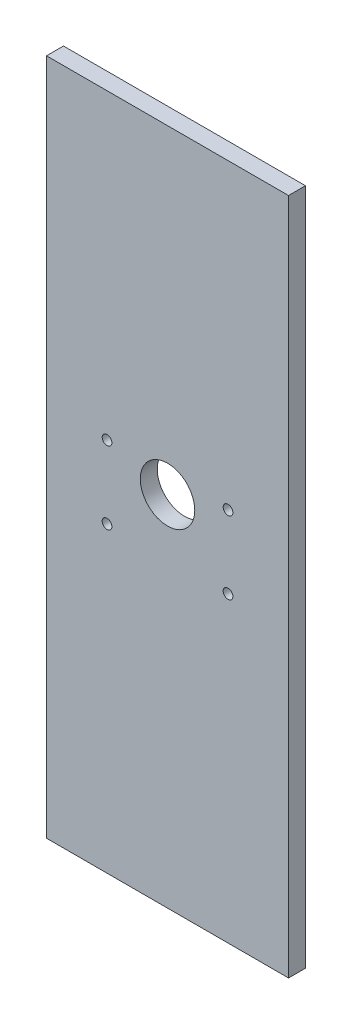
ISO-10303-21;
HEADER;
FILE_DESCRIPTION(('STEP AP214'),'2;1');
FILE_NAME('part.step','',(''),(''),'','','');
FILE_SCHEMA(('AUTOMOTIVE_DESIGN { 1 0 10303 214 1 1 1 1 }'));
ENDSEC;
DATA;
#1=APPLICATION_CONTEXT('core data for automotive mechanical design processes');
#2=APPLICATION_PROTOCOL_DEFINITION('international standard','automotive_design',2000,#1);
#3=PRODUCT_CONTEXT('',#1,'mechanical');
#4=PRODUCT('Part','Part','',(#3));
#5=PRODUCT_RELATED_PRODUCT_CATEGORY('part','',(#4));
#6=PRODUCT_DEFINITION_FORMATION('','',#4);
#7=PRODUCT_DEFINITION_CONTEXT('part definition',#1,'design');
#8=PRODUCT_DEFINITION('design','',#6,#7);
#9=PRODUCT_DEFINITION_SHAPE('','',#8);
#10=(LENGTH_UNIT() NAMED_UNIT(*) SI_UNIT(.MILLI.,.METRE.));
#11=(NAMED_UNIT(*) PLANE_ANGLE_UNIT() SI_UNIT($,.RADIAN.));
#12=(NAMED_UNIT(*) SI_UNIT($,.STERADIAN.) SOLID_ANGLE_UNIT());
#13=UNCERTAINTY_MEASURE_WITH_UNIT(LENGTH_MEASURE(1.E-05),#10,'distance_accuracy_value','');
#14=(GEOMETRIC_REPRESENTATION_CONTEXT(3) GLOBAL_UNCERTAINTY_ASSIGNED_CONTEXT((#13)) GLOBAL_UNIT_ASSIGNED_CONTEXT((#10,
#11,#12)) REPRESENTATION_CONTEXT('',''));
#15=CARTESIAN_POINT('',(0.,0.,0.));
#16=DIRECTION('',(0.,0.,1.));
#17=DIRECTION('',(1.,0.,0.));
#18=AXIS2_PLACEMENT_3D('',#15,#16,#17);
#19=CARTESIAN_POINT('',(63.5,177.8,4.445));
#20=DIRECTION('',(-1.,0.,0.));
#21=DIRECTION('',(0.,-1.,0.));
#22=AXIS2_PLACEMENT_3D('',#19,#20,#21);
#23=PLANE('',#22);
#24=DIRECTION('',(0.,1.,0.));
#25=VECTOR('',#24,1.);
#26=CARTESIAN_POINT('',(63.5,177.8,-4.445));
#27=LINE('',#26,#25);
#28=CARTESIAN_POINT('',(63.5,-177.8,-4.445));
#29=VERTEX_POINT('',#28);
#30=CARTESIAN_POINT('',(63.5,177.8,-4.445));
#31=VERTEX_POINT('',#30);
#32=EDGE_CURVE('E98',#29,#31,#27,.T.);
#33=ORIENTED_EDGE('',*,*,#32,.T.);
#34=DIRECTION('',(0.,0.,-1.));
#35=VECTOR('',#34,1.);
#36=CARTESIAN_POINT('',(63.5,177.8,4.445));
#37=LINE('',#36,#35);
#38=CARTESIAN_POINT('',(63.5,177.8,4.445));
#39=VERTEX_POINT('',#38);
#40=EDGE_CURVE('E11',#39,#31,#37,.T.);
#41=ORIENTED_EDGE('',*,*,#40,.F.);
#42=DIRECTION('',(0.,1.,0.));
#43=VECTOR('',#42,1.);
#44=CARTESIAN_POINT('',(63.5,177.8,4.445));
#45=LINE('',#44,#43);
#46=CARTESIAN_POINT('',(63.5,-177.8,4.445));
#47=VERTEX_POINT('',#46);
#48=EDGE_CURVE('E86',#47,#39,#45,.T.);
#49=ORIENTED_EDGE('',*,*,#48,.F.);
#50=DIRECTION('',(0.,0.,-1.));
#51=VECTOR('',#50,1.);
#52=CARTESIAN_POINT('',(63.5,-177.8,4.445));
#53=LINE('',#52,#51);
#54=EDGE_CURVE('E94',#47,#29,#53,.T.);
#55=ORIENTED_EDGE('',*,*,#54,.T.);
#56=EDGE_LOOP('',(#33,#41,#49,#55));
#57=FACE_BOUND('',#56,.T.);
#58=ADVANCED_FACE('F35',(#57),#23,.F.);
#59=CARTESIAN_POINT('',(-63.5,177.8,4.445));
#60=DIRECTION('',(0.,-1.,0.));
#61=DIRECTION('',(0.,0.,-1.));
#62=AXIS2_PLACEMENT_3D('',#59,#60,#61);
#63=PLANE('',#62);
#64=DIRECTION('',(-1.,0.,0.));
#65=VECTOR('',#64,1.);
#66=CARTESIAN_POINT('',(-63.5,177.8,-4.445));
#67=LINE('',#66,#65);
#68=CARTESIAN_POINT('',(-63.5,177.8,-4.445));
#69=VERTEX_POINT('',#68);
#70=EDGE_CURVE('E90',#31,#69,#67,.T.);
#71=ORIENTED_EDGE('',*,*,#70,.T.);
#72=DIRECTION('',(0.,0.,-1.));
#73=VECTOR('',#72,1.);
#74=CARTESIAN_POINT('',(-63.5,177.8,4.445));
#75=LINE('',#74,#73);
#76=CARTESIAN_POINT('',(-63.5,177.8,4.445));
#77=VERTEX_POINT('',#76);
#78=EDGE_CURVE('E43',#77,#69,#75,.T.);
#79=ORIENTED_EDGE('',*,*,#78,.F.);
#80=DIRECTION('',(-1.,0.,0.));
#81=VECTOR('',#80,1.);
#82=CARTESIAN_POINT('',(-63.5,177.8,4.445));
#83=LINE('',#82,#81);
#84=EDGE_CURVE('E81',#39,#77,#83,.T.);
#85=ORIENTED_EDGE('',*,*,#84,.F.);
#86=ORIENTED_EDGE('',*,*,#40,.T.);
#87=EDGE_LOOP('',(#71,#79,#85,#86));
#88=FACE_BOUND('',#87,.T.);
#89=ADVANCED_FACE('F89',(#88),#63,.F.);
#90=CARTESIAN_POINT('',(-63.5,177.8,4.445));
#91=DIRECTION('',(1.,0.,0.));
#92=DIRECTION('',(0.,1.,0.));
#93=AXIS2_PLACEMENT_3D('',#90,#91,#92);
#94=PLANE('',#93);
#95=DIRECTION('',(0.,-1.,0.));
#96=VECTOR('',#95,1.);
#97=CARTESIAN_POINT('',(-63.5,177.8,-4.445));
#98=LINE('',#97,#96);
#99=CARTESIAN_POINT('',(-63.5,-177.8,-4.445));
#100=VERTEX_POINT('',#99);
#101=EDGE_CURVE('E68',#69,#100,#98,.T.);
#102=ORIENTED_EDGE('',*,*,#101,.T.);
#103=DIRECTION('',(0.,0.,-1.));
#104=VECTOR('',#103,1.);
#105=CARTESIAN_POINT('',(-63.5,-177.8,4.445));
#106=LINE('',#105,#104);
#107=CARTESIAN_POINT('',(-63.5,-177.8,4.445));
#108=VERTEX_POINT('',#107);
#109=EDGE_CURVE('E91',#108,#100,#106,.T.);
#110=ORIENTED_EDGE('',*,*,#109,.F.);
#111=DIRECTION('',(0.,-1.,0.));
#112=VECTOR('',#111,1.);
#113=CARTESIAN_POINT('',(-63.5,177.8,4.445));
#114=LINE('',#113,#112);
#115=EDGE_CURVE('E84',#77,#108,#114,.T.);
#116=ORIENTED_EDGE('',*,*,#115,.F.);
#117=ORIENTED_EDGE('',*,*,#78,.T.);
#118=EDGE_LOOP('',(#102,#110,#116,#117));
#119=FACE_BOUND('',#118,.T.);
#120=ADVANCED_FACE('F92',(#119),#94,.F.);
#121=CARTESIAN_POINT('',(-63.5,-177.8,4.445));
#122=DIRECTION('',(0.,1.,0.));
#123=DIRECTION('',(0.,0.,1.));
#124=AXIS2_PLACEMENT_3D('',#121,#122,#123);
#125=PLANE('',#124);
#126=DIRECTION('',(1.,0.,0.));
#127=VECTOR('',#126,1.);
#128=CARTESIAN_POINT('',(-63.5,-177.8,-4.445));
#129=LINE('',#128,#127);
#130=EDGE_CURVE('E74',#100,#29,#129,.T.);
#131=ORIENTED_EDGE('',*,*,#130,.T.);
#132=ORIENTED_EDGE('',*,*,#54,.F.);
#133=DIRECTION('',(1.,0.,0.));
#134=VECTOR('',#133,1.);
#135=CARTESIAN_POINT('',(-63.5,-177.8,4.445));
#136=LINE('',#135,#134);
#137=EDGE_CURVE('E51',#108,#47,#136,.T.);
#138=ORIENTED_EDGE('',*,*,#137,.F.);
#139=ORIENTED_EDGE('',*,*,#109,.T.);
#140=EDGE_LOOP('',(#131,#132,#138,#139));
#141=FACE_BOUND('',#140,.T.);
#142=ADVANCED_FACE('F106',(#141),#125,.F.);
#143=CARTESIAN_POINT('',(0.,0.,4.445));
#144=DIRECTION('',(0.,0.,1.));
#145=DIRECTION('',(1.,0.,0.));
#146=AXIS2_PLACEMENT_3D('',#143,#144,#145);
#147=PLANE('',#146);
#148=CARTESIAN_POINT('',(31.75,-19.05,4.445));
#149=DIRECTION('',(0.,0.,1.));
#150=DIRECTION('',(1.,0.,0.));
#151=AXIS2_PLACEMENT_3D('',#148,#149,#150);
#152=CIRCLE('',#151,2.54000000000001);
#153=CARTESIAN_POINT('',(34.29,-19.05,4.445));
#154=VERTEX_POINT('',#153);
#155=EDGE_CURVE('E118',#154,#154,#152,.T.);
#156=ORIENTED_EDGE('',*,*,#155,.F.);
#157=EDGE_LOOP('',(#156));
#158=FACE_BOUND('',#157,.T.);
#159=CARTESIAN_POINT('',(31.75,19.05,4.445));
#160=DIRECTION('',(0.,0.,1.));
#161=DIRECTION('',(1.,0.,0.));
#162=AXIS2_PLACEMENT_3D('',#159,#160,#161);
#163=CIRCLE('',#162,2.54000000000001);
#164=CARTESIAN_POINT('',(34.29,19.05,4.445));
#165=VERTEX_POINT('',#164);
#166=EDGE_CURVE('E124',#165,#165,#163,.T.);
#167=ORIENTED_EDGE('',*,*,#166,.F.);
#168=EDGE_LOOP('',(#167));
#169=FACE_BOUND('',#168,.T.);
#170=CARTESIAN_POINT('',(0.,10.125,4.445));
#171=DIRECTION('',(0.,0.,1.));
#172=DIRECTION('',(1.,0.,0.));
#173=AXIS2_PLACEMENT_3D('',#170,#171,#172);
#174=CIRCLE('',#173,14.2875);
#175=CARTESIAN_POINT('',(14.2875,10.125,4.445));
#176=VERTEX_POINT('',#175);
#177=EDGE_CURVE('E130',#176,#176,#174,.T.);
#178=ORIENTED_EDGE('',*,*,#177,.F.);
#179=EDGE_LOOP('',(#178));
#180=FACE_BOUND('',#179,.T.);
#181=CARTESIAN_POINT('',(-31.75,19.05,4.445));
#182=DIRECTION('',(0.,0.,1.));
#183=DIRECTION('',(1.,0.,0.));
#184=AXIS2_PLACEMENT_3D('',#181,#182,#183);
#185=CIRCLE('',#184,2.54);
#186=CARTESIAN_POINT('',(-29.21,19.05,4.445));
#187=VERTEX_POINT('',#186);
#188=EDGE_CURVE('E137',#187,#187,#185,.T.);
#189=ORIENTED_EDGE('',*,*,#188,.F.);
#190=EDGE_LOOP('',(#189));
#191=FACE_BOUND('',#190,.T.);
#192=CARTESIAN_POINT('',(-31.75,-19.05,4.445));
#193=DIRECTION('',(0.,0.,1.));
#194=DIRECTION('',(1.,0.,0.));
#195=AXIS2_PLACEMENT_3D('',#192,#193,#194);
#196=CIRCLE('',#195,2.54);
#197=CARTESIAN_POINT('',(-29.21,-19.05,4.445));
#198=VERTEX_POINT('',#197);
#199=EDGE_CURVE('E112',#198,#198,#196,.T.);
#200=ORIENTED_EDGE('',*,*,#199,.F.);
#201=EDGE_LOOP('',(#200));
#202=FACE_BOUND('',#201,.T.);
#203=ORIENTED_EDGE('',*,*,#48,.T.);
#204=ORIENTED_EDGE('',*,*,#84,.T.);
#205=ORIENTED_EDGE('',*,*,#115,.T.);
#206=ORIENTED_EDGE('',*,*,#137,.T.);
#207=EDGE_LOOP('',(#203,#204,#205,#206));
#208=FACE_BOUND('',#207,.T.);
#209=ADVANCED_FACE('F82',(#158,#169,#180,#191,#202,#208),#147,.T.);
#210=CARTESIAN_POINT('',(0.,0.,-4.445));
#211=DIRECTION('',(0.,0.,1.));
#212=DIRECTION('',(1.,0.,0.));
#213=AXIS2_PLACEMENT_3D('',#210,#211,#212);
#214=PLANE('',#213);
#215=CARTESIAN_POINT('',(31.75,-19.05,-4.445));
#216=DIRECTION('',(0.,0.,1.));
#217=DIRECTION('',(1.,0.,0.));
#218=AXIS2_PLACEMENT_3D('',#215,#216,#217);
#219=CIRCLE('',#218,2.54000000000001);
#220=CARTESIAN_POINT('',(34.29,-19.05,-4.445));
#221=VERTEX_POINT('',#220);
#222=EDGE_CURVE('E121',#221,#221,#219,.T.);
#223=ORIENTED_EDGE('',*,*,#222,.T.);
#224=EDGE_LOOP('',(#223));
#225=FACE_BOUND('',#224,.T.);
#226=CARTESIAN_POINT('',(31.75,19.05,-4.445));
#227=DIRECTION('',(0.,0.,1.));
#228=DIRECTION('',(1.,0.,0.));
#229=AXIS2_PLACEMENT_3D('',#226,#227,#228);
#230=CIRCLE('',#229,2.54000000000001);
#231=CARTESIAN_POINT('',(34.29,19.05,-4.445));
#232=VERTEX_POINT('',#231);
#233=EDGE_CURVE('E127',#232,#232,#230,.T.);
#234=ORIENTED_EDGE('',*,*,#233,.T.);
#235=EDGE_LOOP('',(#234));
#236=FACE_BOUND('',#235,.T.);
#237=CARTESIAN_POINT('',(0.,10.125,-4.445));
#238=DIRECTION('',(0.,0.,1.));
#239=DIRECTION('',(1.,0.,0.));
#240=AXIS2_PLACEMENT_3D('',#237,#238,#239);
#241=CIRCLE('',#240,14.2875);
#242=CARTESIAN_POINT('',(14.2875,10.125,-4.445));
#243=VERTEX_POINT('',#242);
#244=EDGE_CURVE('E133',#243,#243,#241,.T.);
#245=ORIENTED_EDGE('',*,*,#244,.T.);
#246=EDGE_LOOP('',(#245));
#247=FACE_BOUND('',#246,.T.);
#248=CARTESIAN_POINT('',(-31.75,19.05,-4.445));
#249=DIRECTION('',(0.,0.,1.));
#250=DIRECTION('',(1.,0.,0.));
#251=AXIS2_PLACEMENT_3D('',#248,#249,#250);
#252=CIRCLE('',#251,2.54);
#253=CARTESIAN_POINT('',(-29.21,19.05,-4.445));
#254=VERTEX_POINT('',#253);
#255=EDGE_CURVE('E115',#254,#254,#252,.T.);
#256=ORIENTED_EDGE('',*,*,#255,.T.);
#257=EDGE_LOOP('',(#256));
#258=FACE_BOUND('',#257,.T.);
#259=CARTESIAN_POINT('',(-31.75,-19.05,-4.445));
#260=DIRECTION('',(0.,0.,1.));
#261=DIRECTION('',(1.,0.,0.));
#262=AXIS2_PLACEMENT_3D('',#259,#260,#261);
#263=CIRCLE('',#262,2.54);
#264=CARTESIAN_POINT('',(-29.21,-19.05,-4.445));
#265=VERTEX_POINT('',#264);
#266=EDGE_CURVE('E101',#265,#265,#263,.T.);
#267=ORIENTED_EDGE('',*,*,#266,.T.);
#268=EDGE_LOOP('',(#267));
#269=FACE_BOUND('',#268,.T.);
#270=ORIENTED_EDGE('',*,*,#32,.F.);
#271=ORIENTED_EDGE('',*,*,#130,.F.);
#272=ORIENTED_EDGE('',*,*,#101,.F.);
#273=ORIENTED_EDGE('',*,*,#70,.F.);
#274=EDGE_LOOP('',(#270,#271,#272,#273));
#275=FACE_BOUND('',#274,.T.);
#276=ADVANCED_FACE('F109',(#225,#236,#247,#258,#269,#275),#214,.F.);
#277=CARTESIAN_POINT('',(-31.75,-19.05,-4.445));
#278=DIRECTION('',(0.,0.,1.));
#279=DIRECTION('',(1.,0.,0.));
#280=AXIS2_PLACEMENT_3D('',#277,#278,#279);
#281=CYLINDRICAL_SURFACE('',#280,2.54);
#282=ORIENTED_EDGE('',*,*,#266,.F.);
#283=EDGE_LOOP('',(#282));
#284=FACE_BOUND('',#283,.T.);
#285=ORIENTED_EDGE('',*,*,#199,.T.);
#286=EDGE_LOOP('',(#285));
#287=FACE_BOUND('',#286,.T.);
#288=ADVANCED_FACE('F149',(#284,#287),#281,.F.);
#289=CARTESIAN_POINT('',(-31.75,19.05,-4.445));
#290=DIRECTION('',(0.,0.,1.));
#291=DIRECTION('',(1.,0.,0.));
#292=AXIS2_PLACEMENT_3D('',#289,#290,#291);
#293=CYLINDRICAL_SURFACE('',#292,2.54);
#294=ORIENTED_EDGE('',*,*,#255,.F.);
#295=EDGE_LOOP('',(#294));
#296=FACE_BOUND('',#295,.T.);
#297=ORIENTED_EDGE('',*,*,#188,.T.);
#298=EDGE_LOOP('',(#297));
#299=FACE_BOUND('',#298,.T.);
#300=ADVANCED_FACE('F145',(#296,#299),#293,.F.);
#301=CARTESIAN_POINT('',(0.,10.125,-4.445));
#302=DIRECTION('',(0.,0.,1.));
#303=DIRECTION('',(1.,0.,0.));
#304=AXIS2_PLACEMENT_3D('',#301,#302,#303);
#305=CYLINDRICAL_SURFACE('',#304,14.2875);
#306=ORIENTED_EDGE('',*,*,#244,.F.);
#307=EDGE_LOOP('',(#306));
#308=FACE_BOUND('',#307,.T.);
#309=ORIENTED_EDGE('',*,*,#177,.T.);
#310=EDGE_LOOP('',(#309));
#311=FACE_BOUND('',#310,.T.);
#312=ADVANCED_FACE('F148',(#308,#311),#305,.F.);
#313=CARTESIAN_POINT('',(31.75,19.05,-4.445));
#314=DIRECTION('',(0.,0.,1.));
#315=DIRECTION('',(1.,0.,0.));
#316=AXIS2_PLACEMENT_3D('',#313,#314,#315);
#317=CYLINDRICAL_SURFACE('',#316,2.54000000000001);
#318=ORIENTED_EDGE('',*,*,#233,.F.);
#319=EDGE_LOOP('',(#318));
#320=FACE_BOUND('',#319,.T.);
#321=ORIENTED_EDGE('',*,*,#166,.T.);
#322=EDGE_LOOP('',(#321));
#323=FACE_BOUND('',#322,.T.);
#324=ADVANCED_FACE('F210',(#320,#323),#317,.F.);
#325=CARTESIAN_POINT('',(31.75,-19.05,-4.445));
#326=DIRECTION('',(0.,0.,1.));
#327=DIRECTION('',(1.,0.,0.));
#328=AXIS2_PLACEMENT_3D('',#325,#326,#327);
#329=CYLINDRICAL_SURFACE('',#328,2.54000000000001);
#330=ORIENTED_EDGE('',*,*,#222,.F.);
#331=EDGE_LOOP('',(#330));
#332=FACE_BOUND('',#331,.T.);
#333=ORIENTED_EDGE('',*,*,#155,.T.);
#334=EDGE_LOOP('',(#333));
#335=FACE_BOUND('',#334,.T.);
#336=ADVANCED_FACE('F220',(#332,#335),#329,.F.);
#337=CLOSED_SHELL('',(#58,#89,#120,#142,#209,#276,#288,#300,#312,#324,#336));
#338=MANIFOLD_SOLID_BREP('B2',#337);
#339=ADVANCED_BREP_SHAPE_REPRESENTATION('',(#18,#338),#14);
#340=SHAPE_DEFINITION_REPRESENTATION(#9,#339);
ENDSEC;
END-ISO-10303-21;
